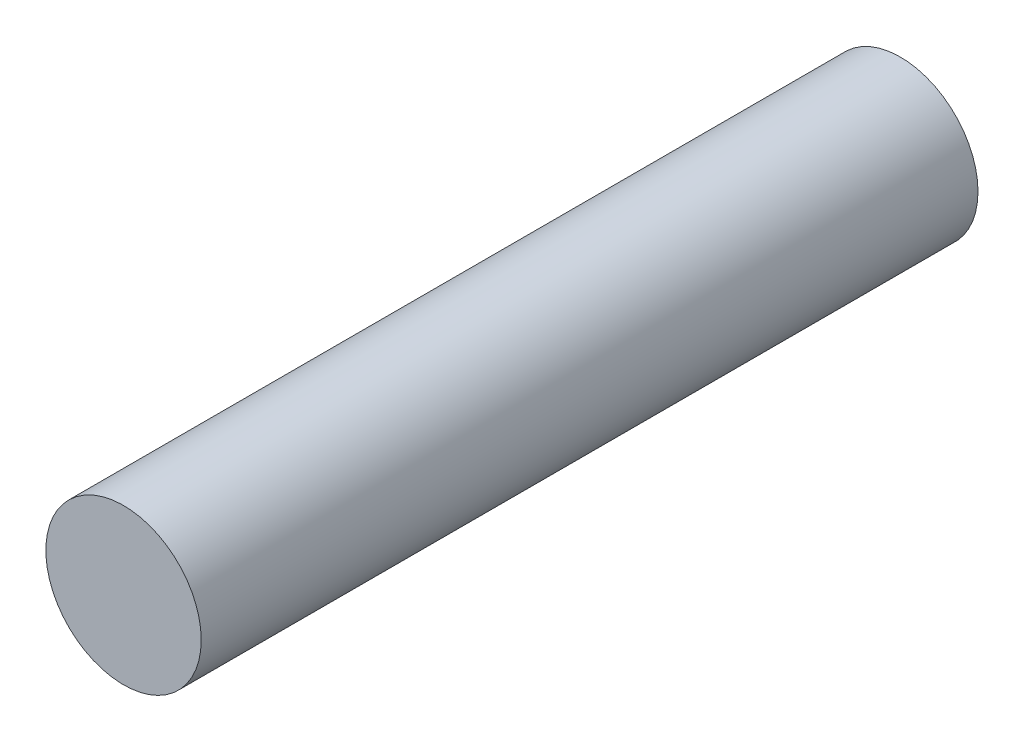
ISO-10303-21;
HEADER;
FILE_DESCRIPTION(('STEP AP214'),'2;1');
FILE_NAME('part.step','',(''),(''),'','','');
FILE_SCHEMA(('AUTOMOTIVE_DESIGN { 1 0 10303 214 1 1 1 1 }'));
ENDSEC;
DATA;
#1=APPLICATION_CONTEXT('core data for automotive mechanical design processes');
#2=APPLICATION_PROTOCOL_DEFINITION('international standard','automotive_design',2000,#1);
#3=PRODUCT_CONTEXT('',#1,'mechanical');
#4=PRODUCT('Part','Part','',(#3));
#5=PRODUCT_RELATED_PRODUCT_CATEGORY('part','',(#4));
#6=PRODUCT_DEFINITION_FORMATION('','',#4);
#7=PRODUCT_DEFINITION_CONTEXT('part definition',#1,'design');
#8=PRODUCT_DEFINITION('design','',#6,#7);
#9=PRODUCT_DEFINITION_SHAPE('','',#8);
#10=(LENGTH_UNIT() NAMED_UNIT(*) SI_UNIT(.MILLI.,.METRE.));
#11=(NAMED_UNIT(*) PLANE_ANGLE_UNIT() SI_UNIT($,.RADIAN.));
#12=(NAMED_UNIT(*) SI_UNIT($,.STERADIAN.) SOLID_ANGLE_UNIT());
#13=UNCERTAINTY_MEASURE_WITH_UNIT(LENGTH_MEASURE(1.E-05),#10,'distance_accuracy_value','');
#14=(GEOMETRIC_REPRESENTATION_CONTEXT(3) GLOBAL_UNCERTAINTY_ASSIGNED_CONTEXT((#13)) GLOBAL_UNIT_ASSIGNED_CONTEXT((#10,
#11,#12)) REPRESENTATION_CONTEXT('',''));
#15=CARTESIAN_POINT('',(0.,0.,0.));
#16=DIRECTION('',(0.,0.,1.));
#17=DIRECTION('',(1.,0.,0.));
#18=AXIS2_PLACEMENT_3D('',#15,#16,#17);
#19=CARTESIAN_POINT('',(0.,0.,75.));
#20=DIRECTION('',(0.,0.,-1.));
#21=DIRECTION('',(-1.,0.,0.));
#22=AXIS2_PLACEMENT_3D('',#19,#20,#21);
#23=CYLINDRICAL_SURFACE('',#22,7.5);
#24=CARTESIAN_POINT('',(0.,0.,75.));
#25=DIRECTION('',(0.,0.,1.));
#26=DIRECTION('',(1.,0.,0.));
#27=AXIS2_PLACEMENT_3D('',#24,#25,#26);
#28=CIRCLE('',#27,7.5);
#29=CARTESIAN_POINT('',(7.5,0.,75.));
#30=VERTEX_POINT('',#29);
#31=EDGE_CURVE('E10',#30,#30,#28,.T.);
#32=ORIENTED_EDGE('',*,*,#31,.F.);
#33=EDGE_LOOP('',(#32));
#34=FACE_BOUND('',#33,.T.);
#35=CARTESIAN_POINT('',(0.,0.,0.));
#36=DIRECTION('',(0.,0.,1.));
#37=DIRECTION('',(1.,0.,0.));
#38=AXIS2_PLACEMENT_3D('',#35,#36,#37);
#39=CIRCLE('',#38,7.5);
#40=CARTESIAN_POINT('',(7.5,0.,0.));
#41=VERTEX_POINT('',#40);
#42=EDGE_CURVE('E35',#41,#41,#39,.T.);
#43=ORIENTED_EDGE('',*,*,#42,.T.);
#44=EDGE_LOOP('',(#43));
#45=FACE_BOUND('',#44,.T.);
#46=ADVANCED_FACE('F32',(#34,#45),#23,.T.);
#47=CARTESIAN_POINT('',(0.,0.,75.));
#48=DIRECTION('',(0.,0.,1.));
#49=DIRECTION('',(1.,0.,0.));
#50=AXIS2_PLACEMENT_3D('',#47,#48,#49);
#51=PLANE('',#50);
#52=ORIENTED_EDGE('',*,*,#31,.T.);
#53=EDGE_LOOP('',(#52));
#54=FACE_BOUND('',#53,.T.);
#55=ADVANCED_FACE('F47',(#54),#51,.T.);
#56=CARTESIAN_POINT('',(0.,0.,0.));
#57=DIRECTION('',(0.,0.,1.));
#58=DIRECTION('',(1.,0.,0.));
#59=AXIS2_PLACEMENT_3D('',#56,#57,#58);
#60=PLANE('',#59);
#61=ORIENTED_EDGE('',*,*,#42,.F.);
#62=EDGE_LOOP('',(#61));
#63=FACE_BOUND('',#62,.T.);
#64=ADVANCED_FACE('F45',(#63),#60,.F.);
#65=CLOSED_SHELL('',(#46,#55,#64));
#66=MANIFOLD_SOLID_BREP('B2',#65);
#67=ADVANCED_BREP_SHAPE_REPRESENTATION('',(#18,#66),#14);
#68=SHAPE_DEFINITION_REPRESENTATION(#9,#67);
ENDSEC;
END-ISO-10303-21;
